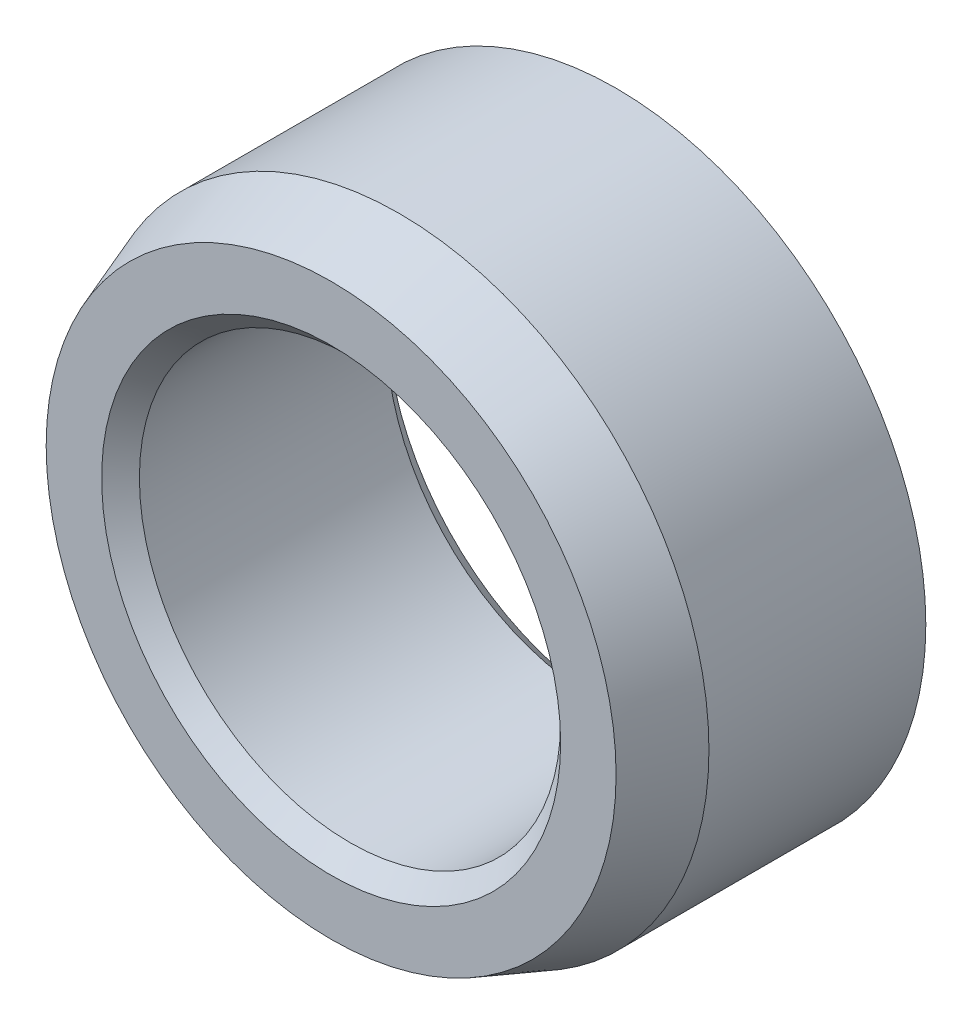
ISO-10303-21;
HEADER;
FILE_DESCRIPTION(('STEP AP214'),'2;1');
FILE_NAME('part.step','',(''),(''),'','','');
FILE_SCHEMA(('AUTOMOTIVE_DESIGN { 1 0 10303 214 1 1 1 1 }'));
ENDSEC;
DATA;
#1=APPLICATION_CONTEXT('core data for automotive mechanical design processes');
#2=APPLICATION_PROTOCOL_DEFINITION('international standard','automotive_design',2000,#1);
#3=PRODUCT_CONTEXT('',#1,'mechanical');
#4=PRODUCT('Part','Part','',(#3));
#5=PRODUCT_RELATED_PRODUCT_CATEGORY('part','',(#4));
#6=PRODUCT_DEFINITION_FORMATION('','',#4);
#7=PRODUCT_DEFINITION_CONTEXT('part definition',#1,'design');
#8=PRODUCT_DEFINITION('design','',#6,#7);
#9=PRODUCT_DEFINITION_SHAPE('','',#8);
#10=(LENGTH_UNIT() NAMED_UNIT(*) SI_UNIT(.MILLI.,.METRE.));
#11=(NAMED_UNIT(*) PLANE_ANGLE_UNIT() SI_UNIT($,.RADIAN.));
#12=(NAMED_UNIT(*) SI_UNIT($,.STERADIAN.) SOLID_ANGLE_UNIT());
#13=UNCERTAINTY_MEASURE_WITH_UNIT(LENGTH_MEASURE(1.E-05),#10,'distance_accuracy_value','');
#14=(GEOMETRIC_REPRESENTATION_CONTEXT(3) GLOBAL_UNCERTAINTY_ASSIGNED_CONTEXT((#13)) GLOBAL_UNIT_ASSIGNED_CONTEXT((#10,
#11,#12)) REPRESENTATION_CONTEXT('',''));
#15=CARTESIAN_POINT('',(0.,0.,0.));
#16=DIRECTION('',(0.,0.,1.));
#17=DIRECTION('',(1.,0.,0.));
#18=AXIS2_PLACEMENT_3D('',#15,#16,#17);
#19=CARTESIAN_POINT('',(0.,11.5,0.));
#20=DIRECTION('',(0.,0.,-1.));
#21=DIRECTION('',(-1.,0.,0.));
#22=AXIS2_PLACEMENT_3D('',#19,#20,#21);
#23=PLANE('',#22);
#24=CARTESIAN_POINT('',(0.,0.,0.));
#25=DIRECTION('',(0.,0.,1.));
#26=DIRECTION('',(1.,0.,0.));
#27=AXIS2_PLACEMENT_3D('',#24,#25,#26);
#28=CIRCLE('',#27,9.262);
#29=CARTESIAN_POINT('',(9.262,0.,0.));
#30=VERTEX_POINT('',#29);
#31=EDGE_CURVE('E10',#30,#30,#28,.T.);
#32=ORIENTED_EDGE('',*,*,#31,.F.);
#33=EDGE_LOOP('',(#32));
#34=FACE_BOUND('',#33,.T.);
#35=CARTESIAN_POINT('',(0.,0.,0.));
#36=DIRECTION('',(0.,0.,1.));
#37=DIRECTION('',(1.,0.,0.));
#38=AXIS2_PLACEMENT_3D('',#35,#36,#37);
#39=CIRCLE('',#38,11.5);
#40=CARTESIAN_POINT('',(11.5,0.,0.));
#41=VERTEX_POINT('',#40);
#42=EDGE_CURVE('E57',#41,#41,#39,.T.);
#43=ORIENTED_EDGE('',*,*,#42,.T.);
#44=EDGE_LOOP('',(#43));
#45=FACE_BOUND('',#44,.T.);
#46=ADVANCED_FACE('F32',(#34,#45),#23,.F.);
#47=CARTESIAN_POINT('',(0.,0.,0.));
#48=DIRECTION('',(0.,0.,1.));
#49=DIRECTION('',(1.,0.,0.));
#50=AXIS2_PLACEMENT_3D('',#47,#48,#49);
#51=CONICAL_SURFACE('',#50,9.262,0.78539816339745);
#52=CARTESIAN_POINT('',(0.,0.,-0.761999999999999));
#53=DIRECTION('',(0.,0.,1.));
#54=DIRECTION('',(1.,0.,0.));
#55=AXIS2_PLACEMENT_3D('',#52,#53,#54);
#56=CIRCLE('',#55,8.5);
#57=CARTESIAN_POINT('',(8.5,0.,-0.761999999999999));
#58=VERTEX_POINT('',#57);
#59=EDGE_CURVE('E38',#58,#58,#56,.T.);
#60=ORIENTED_EDGE('',*,*,#59,.F.);
#61=EDGE_LOOP('',(#60));
#62=FACE_BOUND('',#61,.T.);
#63=ORIENTED_EDGE('',*,*,#31,.T.);
#64=EDGE_LOOP('',(#63));
#65=FACE_BOUND('',#64,.T.);
#66=ADVANCED_FACE('F88',(#62,#65),#51,.F.);
#67=CARTESIAN_POINT('',(0.,0.,30.2699643875511));
#68=DIRECTION('',(0.,0.,1.));
#69=DIRECTION('',(1.,0.,0.));
#70=AXIS2_PLACEMENT_3D('',#67,#68,#69);
#71=CYLINDRICAL_SURFACE('',#70,8.5);
#72=CARTESIAN_POINT('',(0.,0.,-10.738));
#73=DIRECTION('',(0.,0.,1.));
#74=DIRECTION('',(1.,0.,0.));
#75=AXIS2_PLACEMENT_3D('',#72,#73,#74);
#76=CIRCLE('',#75,8.5);
#77=CARTESIAN_POINT('',(8.5,0.,-10.738));
#78=VERTEX_POINT('',#77);
#79=EDGE_CURVE('E42',#78,#78,#76,.T.);
#80=ORIENTED_EDGE('',*,*,#79,.F.);
#81=EDGE_LOOP('',(#80));
#82=FACE_BOUND('',#81,.T.);
#83=ORIENTED_EDGE('',*,*,#59,.T.);
#84=EDGE_LOOP('',(#83));
#85=FACE_BOUND('',#84,.T.);
#86=ADVANCED_FACE('F83',(#82,#85),#71,.F.);
#87=CARTESIAN_POINT('',(0.,0.,-10.738));
#88=DIRECTION('',(0.,0.,-1.));
#89=DIRECTION('',(-1.,0.,0.));
#90=AXIS2_PLACEMENT_3D('',#87,#88,#89);
#91=CONICAL_SURFACE('',#90,8.5,0.785398163397454);
#92=CARTESIAN_POINT('',(0.,0.,-11.5));
#93=DIRECTION('',(0.,0.,1.));
#94=DIRECTION('',(1.,0.,0.));
#95=AXIS2_PLACEMENT_3D('',#92,#93,#94);
#96=CIRCLE('',#95,9.262);
#97=CARTESIAN_POINT('',(9.262,0.,-11.5));
#98=VERTEX_POINT('',#97);
#99=EDGE_CURVE('E46',#98,#98,#96,.T.);
#100=ORIENTED_EDGE('',*,*,#99,.F.);
#101=EDGE_LOOP('',(#100));
#102=FACE_BOUND('',#101,.T.);
#103=ORIENTED_EDGE('',*,*,#79,.T.);
#104=EDGE_LOOP('',(#103));
#105=FACE_BOUND('',#104,.T.);
#106=ADVANCED_FACE('F77',(#102,#105),#91,.F.);
#107=CARTESIAN_POINT('',(0.,9.262,-11.5));
#108=DIRECTION('',(0.,0.,1.));
#109=DIRECTION('',(1.,0.,0.));
#110=AXIS2_PLACEMENT_3D('',#107,#108,#109);
#111=PLANE('',#110);
#112=CARTESIAN_POINT('',(0.,0.,-11.5));
#113=DIRECTION('',(0.,0.,1.));
#114=DIRECTION('',(1.,0.,0.));
#115=AXIS2_PLACEMENT_3D('',#112,#113,#114);
#116=CIRCLE('',#115,12.5);
#117=CARTESIAN_POINT('',(12.5,0.,-11.5));
#118=VERTEX_POINT('',#117);
#119=EDGE_CURVE('E51',#118,#118,#116,.T.);
#120=ORIENTED_EDGE('',*,*,#119,.F.);
#121=EDGE_LOOP('',(#120));
#122=FACE_BOUND('',#121,.T.);
#123=ORIENTED_EDGE('',*,*,#99,.T.);
#124=EDGE_LOOP('',(#123));
#125=FACE_BOUND('',#124,.T.);
#126=ADVANCED_FACE('F71',(#122,#125),#111,.F.);
#127=CARTESIAN_POINT('',(0.,0.,30.2699643875511));
#128=DIRECTION('',(0.,0.,1.));
#129=DIRECTION('',(1.,0.,0.));
#130=AXIS2_PLACEMENT_3D('',#127,#128,#129);
#131=CYLINDRICAL_SURFACE('',#130,12.5);
#132=CARTESIAN_POINT('',(0.,0.,-2.74747741945461));
#133=DIRECTION('',(0.,0.,1.));
#134=DIRECTION('',(1.,0.,0.));
#135=AXIS2_PLACEMENT_3D('',#132,#133,#134);
#136=CIRCLE('',#135,12.5);
#137=CARTESIAN_POINT('',(12.5,0.,-2.74747741945461));
#138=VERTEX_POINT('',#137);
#139=EDGE_CURVE('E54',#138,#138,#136,.T.);
#140=ORIENTED_EDGE('',*,*,#139,.F.);
#141=EDGE_LOOP('',(#140));
#142=FACE_BOUND('',#141,.T.);
#143=ORIENTED_EDGE('',*,*,#119,.T.);
#144=EDGE_LOOP('',(#143));
#145=FACE_BOUND('',#144,.T.);
#146=ADVANCED_FACE('F65',(#142,#145),#131,.T.);
#147=CARTESIAN_POINT('',(0.,0.,-2.74747741945461));
#148=DIRECTION('',(0.,0.,-1.));
#149=DIRECTION('',(-1.,0.,0.));
#150=AXIS2_PLACEMENT_3D('',#147,#148,#149);
#151=CONICAL_SURFACE('',#150,12.5,0.349065850398868);
#152=ORIENTED_EDGE('',*,*,#42,.F.);
#153=EDGE_LOOP('',(#152));
#154=FACE_BOUND('',#153,.T.);
#155=ORIENTED_EDGE('',*,*,#139,.T.);
#156=EDGE_LOOP('',(#155));
#157=FACE_BOUND('',#156,.T.);
#158=ADVANCED_FACE('F62',(#154,#157),#151,.T.);
#159=CLOSED_SHELL('',(#46,#66,#86,#106,#126,#146,#158));
#160=MANIFOLD_SOLID_BREP('B2',#159);
#161=ADVANCED_BREP_SHAPE_REPRESENTATION('',(#18,#160),#14);
#162=SHAPE_DEFINITION_REPRESENTATION(#9,#161);
ENDSEC;
END-ISO-10303-21;
